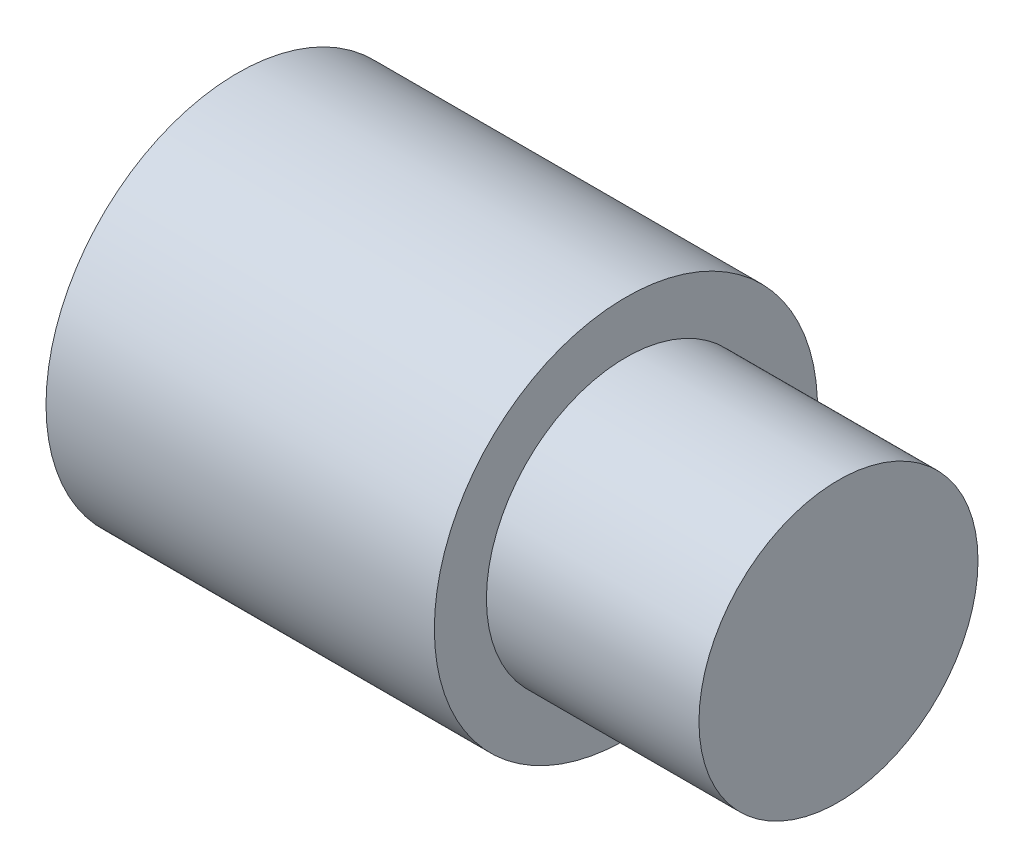
ISO-10303-21;
HEADER;
FILE_DESCRIPTION(('STEP AP214'),'2;1');
FILE_NAME('part.step','',(''),(''),'','','');
FILE_SCHEMA(('AUTOMOTIVE_DESIGN { 1 0 10303 214 1 1 1 1 }'));
ENDSEC;
DATA;
#1=APPLICATION_CONTEXT('core data for automotive mechanical design processes');
#2=APPLICATION_PROTOCOL_DEFINITION('international standard','automotive_design',2000,#1);
#3=PRODUCT_CONTEXT('',#1,'mechanical');
#4=PRODUCT('Part','Part','',(#3));
#5=PRODUCT_RELATED_PRODUCT_CATEGORY('part','',(#4));
#6=PRODUCT_DEFINITION_FORMATION('','',#4);
#7=PRODUCT_DEFINITION_CONTEXT('part definition',#1,'design');
#8=PRODUCT_DEFINITION('design','',#6,#7);
#9=PRODUCT_DEFINITION_SHAPE('','',#8);
#10=(LENGTH_UNIT() NAMED_UNIT(*) SI_UNIT(.MILLI.,.METRE.));
#11=(NAMED_UNIT(*) PLANE_ANGLE_UNIT() SI_UNIT($,.RADIAN.));
#12=(NAMED_UNIT(*) SI_UNIT($,.STERADIAN.) SOLID_ANGLE_UNIT());
#13=UNCERTAINTY_MEASURE_WITH_UNIT(LENGTH_MEASURE(1.E-05),#10,'distance_accuracy_value','');
#14=(GEOMETRIC_REPRESENTATION_CONTEXT(3) GLOBAL_UNCERTAINTY_ASSIGNED_CONTEXT((#13)) GLOBAL_UNIT_ASSIGNED_CONTEXT((#10,
#11,#12)) REPRESENTATION_CONTEXT('',''));
#15=CARTESIAN_POINT('',(0.,0.,0.));
#16=DIRECTION('',(0.,0.,1.));
#17=DIRECTION('',(1.,0.,0.));
#18=AXIS2_PLACEMENT_3D('',#15,#16,#17);
#19=CARTESIAN_POINT('',(13.3,0.,0.));
#20=DIRECTION('',(-1.,0.,0.));
#21=DIRECTION('',(0.,0.,1.));
#22=AXIS2_PLACEMENT_3D('',#19,#20,#21);
#23=PLANE('',#22);
#24=CARTESIAN_POINT('',(13.3000000000001,0.,0.));
#25=DIRECTION('',(-1.,0.,0.));
#26=DIRECTION('',(0.,0.,1.));
#27=AXIS2_PLACEMENT_3D('',#24,#25,#26);
#28=CIRCLE('',#27,8.73);
#29=CARTESIAN_POINT('',(13.3000000000001,0.,8.73));
#30=VERTEX_POINT('',#29);
#31=EDGE_CURVE('E10',#30,#30,#28,.T.);
#32=ORIENTED_EDGE('',*,*,#31,.F.);
#33=EDGE_LOOP('',(#32));
#34=FACE_BOUND('',#33,.T.);
#35=ADVANCED_FACE('F39',(#34),#23,.F.);
#36=CARTESIAN_POINT('',(-1000.,0.,0.));
#37=DIRECTION('',(-1.,0.,0.));
#38=DIRECTION('',(0.,0.,1.));
#39=AXIS2_PLACEMENT_3D('',#36,#37,#38);
#40=CYLINDRICAL_SURFACE('',#39,8.73);
#41=CARTESIAN_POINT('',(0.,0.,0.));
#42=DIRECTION('',(-1.,0.,0.));
#43=DIRECTION('',(0.,0.,1.));
#44=AXIS2_PLACEMENT_3D('',#41,#42,#43);
#45=CIRCLE('',#44,8.73);
#46=CARTESIAN_POINT('',(0.,0.,8.73));
#47=VERTEX_POINT('',#46);
#48=EDGE_CURVE('E46',#47,#47,#45,.T.);
#49=ORIENTED_EDGE('',*,*,#48,.F.);
#50=EDGE_LOOP('',(#49));
#51=FACE_BOUND('',#50,.T.);
#52=ORIENTED_EDGE('',*,*,#31,.T.);
#53=EDGE_LOOP('',(#52));
#54=FACE_BOUND('',#53,.T.);
#55=ADVANCED_FACE('F81',(#51,#54),#40,.T.);
#56=CARTESIAN_POINT('',(0.,8.73,0.));
#57=DIRECTION('',(-1.,0.,0.));
#58=DIRECTION('',(0.,0.,1.));
#59=AXIS2_PLACEMENT_3D('',#56,#57,#58);
#60=PLANE('',#59);
#61=CARTESIAN_POINT('',(0.,0.,0.));
#62=DIRECTION('',(-1.,0.,0.));
#63=DIRECTION('',(0.,0.,1.));
#64=AXIS2_PLACEMENT_3D('',#61,#62,#63);
#65=CIRCLE('',#64,11.988);
#66=CARTESIAN_POINT('',(0.,0.,11.988));
#67=VERTEX_POINT('',#66);
#68=EDGE_CURVE('E49',#67,#67,#65,.T.);
#69=ORIENTED_EDGE('',*,*,#68,.F.);
#70=EDGE_LOOP('',(#69));
#71=FACE_BOUND('',#70,.T.);
#72=ORIENTED_EDGE('',*,*,#48,.T.);
#73=EDGE_LOOP('',(#72));
#74=FACE_BOUND('',#73,.T.);
#75=ADVANCED_FACE('F79',(#71,#74),#60,.F.);
#76=CARTESIAN_POINT('',(-1000.,0.,0.));
#77=DIRECTION('',(-1.,0.,0.));
#78=DIRECTION('',(0.,0.,1.));
#79=AXIS2_PLACEMENT_3D('',#76,#77,#78);
#80=CYLINDRICAL_SURFACE('',#79,11.988);
#81=CARTESIAN_POINT('',(-24.3,0.,0.));
#82=DIRECTION('',(-1.,0.,0.));
#83=DIRECTION('',(0.,0.,1.));
#84=AXIS2_PLACEMENT_3D('',#81,#82,#83);
#85=CIRCLE('',#84,11.988);
#86=CARTESIAN_POINT('',(-24.3,0.,11.988));
#87=VERTEX_POINT('',#86);
#88=EDGE_CURVE('E54',#87,#87,#85,.T.);
#89=ORIENTED_EDGE('',*,*,#88,.F.);
#90=EDGE_LOOP('',(#89));
#91=FACE_BOUND('',#90,.T.);
#92=ORIENTED_EDGE('',*,*,#68,.T.);
#93=EDGE_LOOP('',(#92));
#94=FACE_BOUND('',#93,.T.);
#95=ADVANCED_FACE('F67',(#91,#94),#80,.T.);
#96=CARTESIAN_POINT('',(-24.3,11.988,0.));
#97=DIRECTION('',(1.,0.,0.));
#98=DIRECTION('',(0.,0.,-1.));
#99=AXIS2_PLACEMENT_3D('',#96,#97,#98);
#100=PLANE('',#99);
#101=CARTESIAN_POINT('',(-24.3,0.,0.));
#102=DIRECTION('',(1.,0.,0.));
#103=DIRECTION('',(0.,0.,-1.));
#104=AXIS2_PLACEMENT_3D('',#101,#102,#103);
#105=CIRCLE('',#104,3.175);
#106=CARTESIAN_POINT('',(-24.3,0.,-3.175));
#107=VERTEX_POINT('',#106);
#108=EDGE_CURVE('E45',#107,#107,#105,.F.);
#109=ORIENTED_EDGE('',*,*,#108,.F.);
#110=EDGE_LOOP('',(#109));
#111=FACE_BOUND('',#110,.T.);
#112=ORIENTED_EDGE('',*,*,#88,.T.);
#113=EDGE_LOOP('',(#112));
#114=FACE_BOUND('',#113,.T.);
#115=ADVANCED_FACE('F66',(#111,#114),#100,.F.);
#116=CARTESIAN_POINT('',(-1000.,0.,0.));
#117=DIRECTION('',(-1.,0.,0.));
#118=DIRECTION('',(0.,0.,1.));
#119=AXIS2_PLACEMENT_3D('',#116,#117,#118);
#120=CYLINDRICAL_SURFACE('',#119,3.175);
#121=CARTESIAN_POINT('',(-9.1,0.,0.));
#122=DIRECTION('',(-1.,0.,0.));
#123=DIRECTION('',(0.,0.,1.));
#124=AXIS2_PLACEMENT_3D('',#121,#122,#123);
#125=CIRCLE('',#124,3.175);
#126=CARTESIAN_POINT('',(-9.1,0.,3.175));
#127=VERTEX_POINT('',#126);
#128=EDGE_CURVE('E59',#127,#127,#125,.T.);
#129=ORIENTED_EDGE('',*,*,#128,.F.);
#130=EDGE_LOOP('',(#129));
#131=FACE_BOUND('',#130,.T.);
#132=ORIENTED_EDGE('',*,*,#108,.T.);
#133=EDGE_LOOP('',(#132));
#134=FACE_BOUND('',#133,.T.);
#135=ADVANCED_FACE('F62',(#131,#134),#120,.F.);
#136=CARTESIAN_POINT('',(-9.1,3.175,0.));
#137=DIRECTION('',(-1.,0.,0.));
#138=DIRECTION('',(0.,0.,1.));
#139=AXIS2_PLACEMENT_3D('',#136,#137,#138);
#140=PLANE('',#139);
#141=ORIENTED_EDGE('',*,*,#128,.T.);
#142=EDGE_LOOP('',(#141));
#143=FACE_BOUND('',#142,.T.);
#144=ADVANCED_FACE('F94',(#143),#140,.T.);
#145=CLOSED_SHELL('',(#35,#55,#75,#95,#115,#135,#144));
#146=MANIFOLD_SOLID_BREP('B2',#145);
#147=ADVANCED_BREP_SHAPE_REPRESENTATION('',(#18,#146),#14);
#148=SHAPE_DEFINITION_REPRESENTATION(#9,#147);
ENDSEC;
END-ISO-10303-21;
